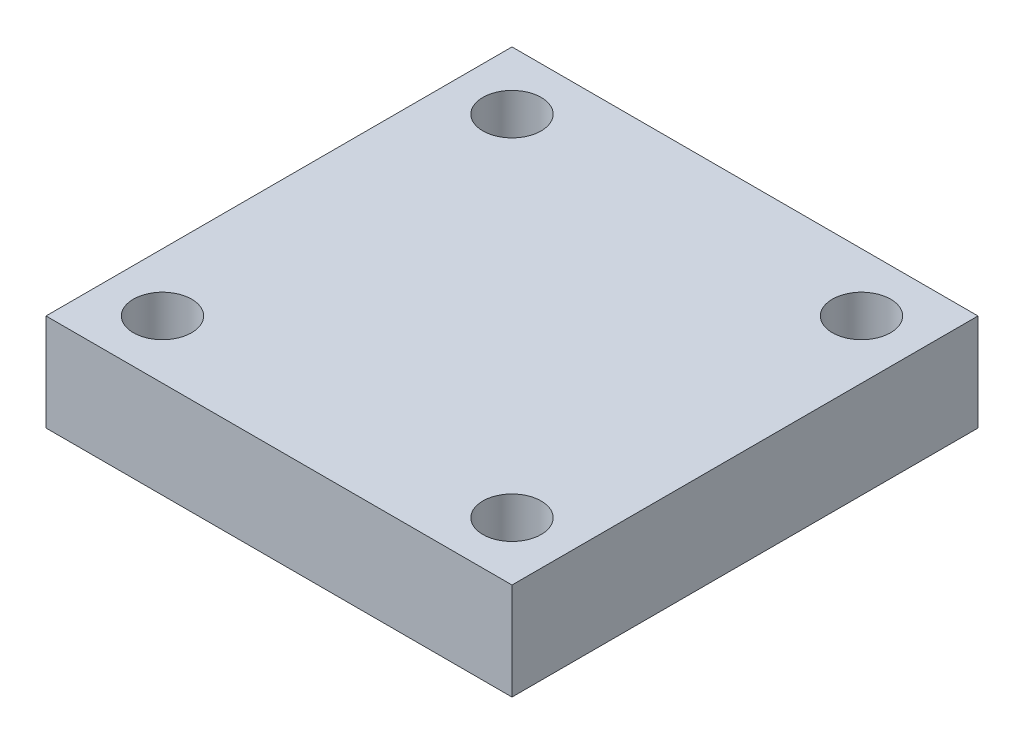
ISO-10303-21;
HEADER;
FILE_DESCRIPTION(('STEP AP214'),'2;1');
FILE_NAME('part.step','',(''),(''),'','','');
FILE_SCHEMA(('AUTOMOTIVE_DESIGN { 1 0 10303 214 1 1 1 1 }'));
ENDSEC;
DATA;
#1=APPLICATION_CONTEXT('core data for automotive mechanical design processes');
#2=APPLICATION_PROTOCOL_DEFINITION('international standard','automotive_design',2000,#1);
#3=PRODUCT_CONTEXT('',#1,'mechanical');
#4=PRODUCT('Part','Part','',(#3));
#5=PRODUCT_RELATED_PRODUCT_CATEGORY('part','',(#4));
#6=PRODUCT_DEFINITION_FORMATION('','',#4);
#7=PRODUCT_DEFINITION_CONTEXT('part definition',#1,'design');
#8=PRODUCT_DEFINITION('design','',#6,#7);
#9=PRODUCT_DEFINITION_SHAPE('','',#8);
#10=(LENGTH_UNIT() NAMED_UNIT(*) SI_UNIT(.MILLI.,.METRE.));
#11=(NAMED_UNIT(*) PLANE_ANGLE_UNIT() SI_UNIT($,.RADIAN.));
#12=(NAMED_UNIT(*) SI_UNIT($,.STERADIAN.) SOLID_ANGLE_UNIT());
#13=UNCERTAINTY_MEASURE_WITH_UNIT(LENGTH_MEASURE(1.E-05),#10,'distance_accuracy_value','');
#14=(GEOMETRIC_REPRESENTATION_CONTEXT(3) GLOBAL_UNCERTAINTY_ASSIGNED_CONTEXT((#13)) GLOBAL_UNIT_ASSIGNED_CONTEXT((#10,
#11,#12)) REPRESENTATION_CONTEXT('',''));
#15=CARTESIAN_POINT('',(0.,0.,0.));
#16=DIRECTION('',(0.,0.,1.));
#17=DIRECTION('',(1.,0.,0.));
#18=AXIS2_PLACEMENT_3D('',#15,#16,#17);
#19=CARTESIAN_POINT('',(-6.18846895461763,5.,-14.1407188382637));
#20=DIRECTION('',(1.,0.,0.));
#21=DIRECTION('',(0.,0.,-1.));
#22=AXIS2_PLACEMENT_3D('',#19,#20,#21);
#23=PLANE('',#22);
#24=DIRECTION('',(0.,0.,1.));
#25=VECTOR('',#24,1.);
#26=CARTESIAN_POINT('',(-6.18846895461763,0.,-14.1407188382637));
#27=LINE('',#26,#25);
#28=CARTESIAN_POINT('',(-6.18846895461763,0.,-14.1407188382637));
#29=VERTEX_POINT('',#28);
#30=CARTESIAN_POINT('',(-6.18846895461762,0.,9.85928116173629));
#31=VERTEX_POINT('',#30);
#32=EDGE_CURVE('E119',#29,#31,#27,.T.);
#33=ORIENTED_EDGE('',*,*,#32,.T.);
#34=DIRECTION('',(0.,-1.,0.));
#35=VECTOR('',#34,1.);
#36=CARTESIAN_POINT('',(-6.18846895461762,5.,9.85928116173629));
#37=LINE('',#36,#35);
#38=CARTESIAN_POINT('',(-6.18846895461762,5.,9.85928116173629));
#39=VERTEX_POINT('',#38);
#40=EDGE_CURVE('E11',#39,#31,#37,.T.);
#41=ORIENTED_EDGE('',*,*,#40,.F.);
#42=DIRECTION('',(0.,0.,1.));
#43=VECTOR('',#42,1.);
#44=CARTESIAN_POINT('',(-6.18846895461763,5.,-14.1407188382637));
#45=LINE('',#44,#43);
#46=CARTESIAN_POINT('',(-6.18846895461763,5.,-14.1407188382637));
#47=VERTEX_POINT('',#46);
#48=EDGE_CURVE('E103',#47,#39,#45,.T.);
#49=ORIENTED_EDGE('',*,*,#48,.F.);
#50=DIRECTION('',(0.,-1.,0.));
#51=VECTOR('',#50,1.);
#52=CARTESIAN_POINT('',(-6.18846895461763,5.,-14.1407188382637));
#53=LINE('',#52,#51);
#54=EDGE_CURVE('E115',#47,#29,#53,.T.);
#55=ORIENTED_EDGE('',*,*,#54,.T.);
#56=EDGE_LOOP('',(#33,#41,#49,#55));
#57=FACE_BOUND('',#56,.T.);
#58=ADVANCED_FACE('F51',(#57),#23,.F.);
#59=CARTESIAN_POINT('',(-6.18846895461762,5.,9.85928116173629));
#60=DIRECTION('',(0.,0.,-1.));
#61=DIRECTION('',(-1.,0.,0.));
#62=AXIS2_PLACEMENT_3D('',#59,#60,#61);
#63=PLANE('',#62);
#64=DIRECTION('',(1.,0.,0.));
#65=VECTOR('',#64,1.);
#66=CARTESIAN_POINT('',(-6.18846895461762,0.,9.85928116173629));
#67=LINE('',#66,#65);
#68=CARTESIAN_POINT('',(17.8115310453824,0.,9.85928116173629));
#69=VERTEX_POINT('',#68);
#70=EDGE_CURVE('E108',#31,#69,#67,.T.);
#71=ORIENTED_EDGE('',*,*,#70,.T.);
#72=DIRECTION('',(0.,-1.,0.));
#73=VECTOR('',#72,1.);
#74=CARTESIAN_POINT('',(17.8115310453824,5.,9.85928116173629));
#75=LINE('',#74,#73);
#76=CARTESIAN_POINT('',(17.8115310453824,5.,9.85928116173629));
#77=VERTEX_POINT('',#76);
#78=EDGE_CURVE('E60',#77,#69,#75,.T.);
#79=ORIENTED_EDGE('',*,*,#78,.F.);
#80=DIRECTION('',(1.,0.,0.));
#81=VECTOR('',#80,1.);
#82=CARTESIAN_POINT('',(-6.18846895461762,5.,9.85928116173629));
#83=LINE('',#82,#81);
#84=EDGE_CURVE('E98',#39,#77,#83,.T.);
#85=ORIENTED_EDGE('',*,*,#84,.F.);
#86=ORIENTED_EDGE('',*,*,#40,.T.);
#87=EDGE_LOOP('',(#71,#79,#85,#86));
#88=FACE_BOUND('',#87,.T.);
#89=ADVANCED_FACE('F107',(#88),#63,.F.);
#90=CARTESIAN_POINT('',(17.8115310453824,5.,-14.1407188382637));
#91=DIRECTION('',(-1.,0.,0.));
#92=DIRECTION('',(0.,0.,1.));
#93=AXIS2_PLACEMENT_3D('',#90,#91,#92);
#94=PLANE('',#93);
#95=DIRECTION('',(0.,0.,-1.));
#96=VECTOR('',#95,1.);
#97=CARTESIAN_POINT('',(17.8115310453824,0.,-14.1407188382637));
#98=LINE('',#97,#96);
#99=CARTESIAN_POINT('',(17.8115310453824,0.,-14.1407188382637));
#100=VERTEX_POINT('',#99);
#101=EDGE_CURVE('E85',#69,#100,#98,.T.);
#102=ORIENTED_EDGE('',*,*,#101,.T.);
#103=DIRECTION('',(0.,-1.,0.));
#104=VECTOR('',#103,1.);
#105=CARTESIAN_POINT('',(17.8115310453824,5.,-14.1407188382637));
#106=LINE('',#105,#104);
#107=CARTESIAN_POINT('',(17.8115310453824,5.,-14.1407188382637));
#108=VERTEX_POINT('',#107);
#109=EDGE_CURVE('E110',#108,#100,#106,.T.);
#110=ORIENTED_EDGE('',*,*,#109,.F.);
#111=DIRECTION('',(0.,0.,-1.));
#112=VECTOR('',#111,1.);
#113=CARTESIAN_POINT('',(17.8115310453824,5.,-14.1407188382637));
#114=LINE('',#113,#112);
#115=EDGE_CURVE('E101',#77,#108,#114,.T.);
#116=ORIENTED_EDGE('',*,*,#115,.F.);
#117=ORIENTED_EDGE('',*,*,#78,.T.);
#118=EDGE_LOOP('',(#102,#110,#116,#117));
#119=FACE_BOUND('',#118,.T.);
#120=ADVANCED_FACE('F111',(#119),#94,.F.);
#121=CARTESIAN_POINT('',(-6.18846895461763,5.,-14.1407188382637));
#122=DIRECTION('',(0.,0.,1.));
#123=DIRECTION('',(1.,0.,0.));
#124=AXIS2_PLACEMENT_3D('',#121,#122,#123);
#125=PLANE('',#124);
#126=DIRECTION('',(-1.,0.,0.));
#127=VECTOR('',#126,1.);
#128=CARTESIAN_POINT('',(-6.18846895461763,0.,-14.1407188382637));
#129=LINE('',#128,#127);
#130=EDGE_CURVE('E91',#100,#29,#129,.T.);
#131=ORIENTED_EDGE('',*,*,#130,.T.);
#132=ORIENTED_EDGE('',*,*,#54,.F.);
#133=DIRECTION('',(-1.,0.,0.));
#134=VECTOR('',#133,1.);
#135=CARTESIAN_POINT('',(-6.18846895461763,5.,-14.1407188382637));
#136=LINE('',#135,#134);
#137=EDGE_CURVE('E68',#108,#47,#136,.T.);
#138=ORIENTED_EDGE('',*,*,#137,.F.);
#139=ORIENTED_EDGE('',*,*,#109,.T.);
#140=EDGE_LOOP('',(#131,#132,#138,#139));
#141=FACE_BOUND('',#140,.T.);
#142=ADVANCED_FACE('F133',(#141),#125,.F.);
#143=CARTESIAN_POINT('',(0.,5.,0.));
#144=DIRECTION('',(0.,1.,0.));
#145=DIRECTION('',(0.,0.,1.));
#146=AXIS2_PLACEMENT_3D('',#143,#144,#145);
#147=PLANE('',#146);
#148=CARTESIAN_POINT('',(14.8115310453824,5.,-11.1407188382637));
#149=DIRECTION('',(0.,1.,0.));
#150=DIRECTION('',(0.,0.,-1.));
#151=AXIS2_PLACEMENT_3D('',#148,#149,#150);
#152=CIRCLE('',#151,1.5);
#153=CARTESIAN_POINT('',(14.8115310453824,5.,-12.6407188382637));
#154=VERTEX_POINT('',#153);
#155=EDGE_CURVE('E148',#154,#154,#152,.T.);
#156=ORIENTED_EDGE('',*,*,#155,.F.);
#157=EDGE_LOOP('',(#156));
#158=FACE_BOUND('',#157,.T.);
#159=CARTESIAN_POINT('',(14.8115310453824,5.,6.85928116173629));
#160=DIRECTION('',(0.,1.,0.));
#161=DIRECTION('',(0.,0.,1.));
#162=AXIS2_PLACEMENT_3D('',#159,#160,#161);
#163=CIRCLE('',#162,1.5);
#164=CARTESIAN_POINT('',(14.8115310453824,5.,8.35928116173629));
#165=VERTEX_POINT('',#164);
#166=EDGE_CURVE('E156',#165,#165,#163,.T.);
#167=ORIENTED_EDGE('',*,*,#166,.F.);
#168=EDGE_LOOP('',(#167));
#169=FACE_BOUND('',#168,.T.);
#170=CARTESIAN_POINT('',(-3.18846895461762,5.,6.85928116173629));
#171=DIRECTION('',(0.,1.,0.));
#172=DIRECTION('',(0.,0.,-1.));
#173=AXIS2_PLACEMENT_3D('',#170,#171,#172);
#174=CIRCLE('',#173,1.5);
#175=CARTESIAN_POINT('',(-3.18846895461762,5.,5.35928116173629));
#176=VERTEX_POINT('',#175);
#177=EDGE_CURVE('E164',#176,#176,#174,.T.);
#178=ORIENTED_EDGE('',*,*,#177,.F.);
#179=EDGE_LOOP('',(#178));
#180=FACE_BOUND('',#179,.T.);
#181=CARTESIAN_POINT('',(-3.18846895461762,5.,-11.1407188382637));
#182=DIRECTION('',(0.,1.,0.));
#183=DIRECTION('',(0.,0.,1.));
#184=AXIS2_PLACEMENT_3D('',#181,#182,#183);
#185=CIRCLE('',#184,1.5);
#186=CARTESIAN_POINT('',(-3.18846895461762,5.,-9.64071883826371));
#187=VERTEX_POINT('',#186);
#188=EDGE_CURVE('E123',#187,#187,#185,.T.);
#189=ORIENTED_EDGE('',*,*,#188,.F.);
#190=EDGE_LOOP('',(#189));
#191=FACE_BOUND('',#190,.T.);
#192=ORIENTED_EDGE('',*,*,#48,.T.);
#193=ORIENTED_EDGE('',*,*,#84,.T.);
#194=ORIENTED_EDGE('',*,*,#115,.T.);
#195=ORIENTED_EDGE('',*,*,#137,.T.);
#196=EDGE_LOOP('',(#192,#193,#194,#195));
#197=FACE_BOUND('',#196,.T.);
#198=ADVANCED_FACE('F99',(#158,#169,#180,#191,#197),#147,.T.);
#199=CARTESIAN_POINT('',(0.,0.,0.));
#200=DIRECTION('',(0.,1.,0.));
#201=DIRECTION('',(0.,0.,1.));
#202=AXIS2_PLACEMENT_3D('',#199,#200,#201);
#203=PLANE('',#202);
#204=CARTESIAN_POINT('',(14.8115310453824,0.,-11.1407188382637));
#205=DIRECTION('',(0.,1.,0.));
#206=DIRECTION('',(0.,0.,-1.));
#207=AXIS2_PLACEMENT_3D('',#204,#205,#206);
#208=CIRCLE('',#207,1.5);
#209=CARTESIAN_POINT('',(14.8115310453824,0.,-12.6407188382637));
#210=VERTEX_POINT('',#209);
#211=EDGE_CURVE('E152',#210,#210,#208,.T.);
#212=ORIENTED_EDGE('',*,*,#211,.T.);
#213=EDGE_LOOP('',(#212));
#214=FACE_BOUND('',#213,.T.);
#215=CARTESIAN_POINT('',(14.8115310453824,0.,6.85928116173629));
#216=DIRECTION('',(0.,1.,0.));
#217=DIRECTION('',(0.,0.,1.));
#218=AXIS2_PLACEMENT_3D('',#215,#216,#217);
#219=CIRCLE('',#218,1.5);
#220=CARTESIAN_POINT('',(14.8115310453824,0.,8.35928116173629));
#221=VERTEX_POINT('',#220);
#222=EDGE_CURVE('E160',#221,#221,#219,.T.);
#223=ORIENTED_EDGE('',*,*,#222,.T.);
#224=EDGE_LOOP('',(#223));
#225=FACE_BOUND('',#224,.T.);
#226=CARTESIAN_POINT('',(-3.18846895461762,0.,6.85928116173629));
#227=DIRECTION('',(0.,1.,0.));
#228=DIRECTION('',(0.,0.,-1.));
#229=AXIS2_PLACEMENT_3D('',#226,#227,#228);
#230=CIRCLE('',#229,1.5);
#231=CARTESIAN_POINT('',(-3.18846895461762,0.,5.35928116173629));
#232=VERTEX_POINT('',#231);
#233=EDGE_CURVE('E144',#232,#232,#230,.T.);
#234=ORIENTED_EDGE('',*,*,#233,.T.);
#235=EDGE_LOOP('',(#234));
#236=FACE_BOUND('',#235,.T.);
#237=CARTESIAN_POINT('',(-3.18846895461762,0.,-11.1407188382637));
#238=DIRECTION('',(0.,1.,0.));
#239=DIRECTION('',(0.,0.,1.));
#240=AXIS2_PLACEMENT_3D('',#237,#238,#239);
#241=CIRCLE('',#240,1.5);
#242=CARTESIAN_POINT('',(-3.18846895461762,0.,-9.64071883826371));
#243=VERTEX_POINT('',#242);
#244=EDGE_CURVE('E140',#243,#243,#241,.T.);
#245=ORIENTED_EDGE('',*,*,#244,.T.);
#246=EDGE_LOOP('',(#245));
#247=FACE_BOUND('',#246,.T.);
#248=ORIENTED_EDGE('',*,*,#32,.F.);
#249=ORIENTED_EDGE('',*,*,#130,.F.);
#250=ORIENTED_EDGE('',*,*,#101,.F.);
#251=ORIENTED_EDGE('',*,*,#70,.F.);
#252=EDGE_LOOP('',(#248,#249,#250,#251));
#253=FACE_BOUND('',#252,.T.);
#254=ADVANCED_FACE('F136',(#214,#225,#236,#247,#253),#203,.F.);
#255=CARTESIAN_POINT('',(-3.18846895461762,5.,-11.1407188382637));
#256=DIRECTION('',(0.,-1.,0.));
#257=DIRECTION('',(0.,0.,-1.));
#258=AXIS2_PLACEMENT_3D('',#255,#256,#257);
#259=CYLINDRICAL_SURFACE('',#258,1.5);
#260=ORIENTED_EDGE('',*,*,#188,.T.);
#261=EDGE_LOOP('',(#260));
#262=FACE_BOUND('',#261,.T.);
#263=ORIENTED_EDGE('',*,*,#244,.F.);
#264=EDGE_LOOP('',(#263));
#265=FACE_BOUND('',#264,.T.);
#266=ADVANCED_FACE('F177',(#262,#265),#259,.F.);
#267=CARTESIAN_POINT('',(-3.18846895461762,5.,6.85928116173629));
#268=DIRECTION('',(0.,-1.,0.));
#269=DIRECTION('',(0.,0.,-1.));
#270=AXIS2_PLACEMENT_3D('',#267,#268,#269);
#271=CYLINDRICAL_SURFACE('',#270,1.5);
#272=ORIENTED_EDGE('',*,*,#177,.T.);
#273=EDGE_LOOP('',(#272));
#274=FACE_BOUND('',#273,.T.);
#275=ORIENTED_EDGE('',*,*,#233,.F.);
#276=EDGE_LOOP('',(#275));
#277=FACE_BOUND('',#276,.T.);
#278=ADVANCED_FACE('F174',(#274,#277),#271,.F.);
#279=CARTESIAN_POINT('',(14.8115310453824,5.,6.85928116173629));
#280=DIRECTION('',(0.,-1.,0.));
#281=DIRECTION('',(0.,0.,-1.));
#282=AXIS2_PLACEMENT_3D('',#279,#280,#281);
#283=CYLINDRICAL_SURFACE('',#282,1.5);
#284=ORIENTED_EDGE('',*,*,#166,.T.);
#285=EDGE_LOOP('',(#284));
#286=FACE_BOUND('',#285,.T.);
#287=ORIENTED_EDGE('',*,*,#222,.F.);
#288=EDGE_LOOP('',(#287));
#289=FACE_BOUND('',#288,.T.);
#290=ADVANCED_FACE('F176',(#286,#289),#283,.F.);
#291=CARTESIAN_POINT('',(14.8115310453824,5.,-11.1407188382637));
#292=DIRECTION('',(0.,-1.,0.));
#293=DIRECTION('',(0.,0.,-1.));
#294=AXIS2_PLACEMENT_3D('',#291,#292,#293);
#295=CYLINDRICAL_SURFACE('',#294,1.5);
#296=ORIENTED_EDGE('',*,*,#155,.T.);
#297=EDGE_LOOP('',(#296));
#298=FACE_BOUND('',#297,.T.);
#299=ORIENTED_EDGE('',*,*,#211,.F.);
#300=EDGE_LOOP('',(#299));
#301=FACE_BOUND('',#300,.T.);
#302=ADVANCED_FACE('F184',(#298,#301),#295,.F.);
#303=CLOSED_SHELL('',(#58,#89,#120,#142,#198,#254,#266,#278,#290,#302));
#304=MANIFOLD_SOLID_BREP('B2',#303);
#305=ADVANCED_BREP_SHAPE_REPRESENTATION('',(#18,#304),#14);
#306=SHAPE_DEFINITION_REPRESENTATION(#9,#305);
ENDSEC;
END-ISO-10303-21;
